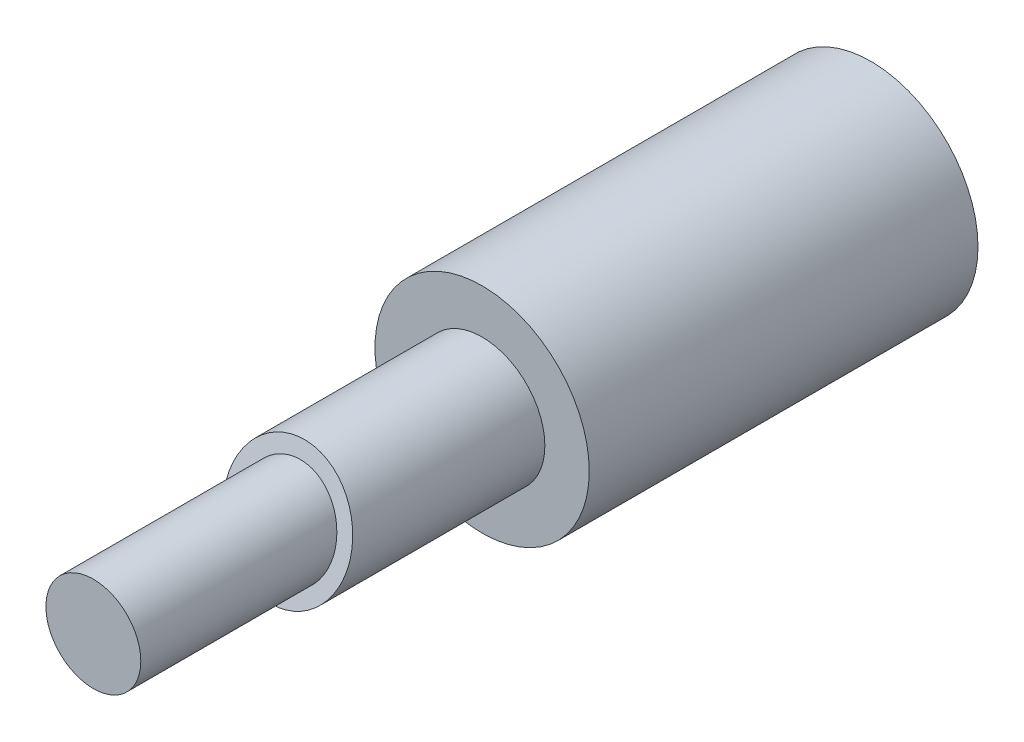
ISO-10303-21;
HEADER;
FILE_DESCRIPTION(('STEP AP214'),'2;1');
FILE_NAME('part.step','',(''),(''),'','','');
FILE_SCHEMA(('AUTOMOTIVE_DESIGN { 1 0 10303 214 1 1 1 1 }'));
ENDSEC;
DATA;
#1=APPLICATION_CONTEXT('core data for automotive mechanical design processes');
#2=APPLICATION_PROTOCOL_DEFINITION('international standard','automotive_design',2000,#1);
#3=PRODUCT_CONTEXT('',#1,'mechanical');
#4=PRODUCT('Part','Part','',(#3));
#5=PRODUCT_RELATED_PRODUCT_CATEGORY('part','',(#4));
#6=PRODUCT_DEFINITION_FORMATION('','',#4);
#7=PRODUCT_DEFINITION_CONTEXT('part definition',#1,'design');
#8=PRODUCT_DEFINITION('design','',#6,#7);
#9=PRODUCT_DEFINITION_SHAPE('','',#8);
#10=(LENGTH_UNIT() NAMED_UNIT(*) SI_UNIT(.MILLI.,.METRE.));
#11=(NAMED_UNIT(*) PLANE_ANGLE_UNIT() SI_UNIT($,.RADIAN.));
#12=(NAMED_UNIT(*) SI_UNIT($,.STERADIAN.) SOLID_ANGLE_UNIT());
#13=UNCERTAINTY_MEASURE_WITH_UNIT(LENGTH_MEASURE(1.E-05),#10,'distance_accuracy_value','');
#14=(GEOMETRIC_REPRESENTATION_CONTEXT(3) GLOBAL_UNCERTAINTY_ASSIGNED_CONTEXT((#13)) GLOBAL_UNIT_ASSIGNED_CONTEXT((#10,
#11,#12)) REPRESENTATION_CONTEXT('',''));
#15=CARTESIAN_POINT('',(0.,0.,0.));
#16=DIRECTION('',(0.,0.,1.));
#17=DIRECTION('',(1.,0.,0.));
#18=AXIS2_PLACEMENT_3D('',#15,#16,#17);
#19=CARTESIAN_POINT('',(0.,0.,-101.6));
#20=DIRECTION('',(0.,0.,-1.));
#21=DIRECTION('',(-1.,0.,0.));
#22=AXIS2_PLACEMENT_3D('',#19,#20,#21);
#23=PLANE('',#22);
#24=CARTESIAN_POINT('',(0.,0.,-101.6));
#25=DIRECTION('',(0.,0.,1.));
#26=DIRECTION('',(1.,0.,0.));
#27=AXIS2_PLACEMENT_3D('',#24,#25,#26);
#28=CIRCLE('',#27,14.);
#29=CARTESIAN_POINT('',(14.,0.,-101.6));
#30=VERTEX_POINT('',#29);
#31=EDGE_CURVE('E10',#30,#30,#28,.T.);
#32=ORIENTED_EDGE('',*,*,#31,.F.);
#33=EDGE_LOOP('',(#32));
#34=FACE_BOUND('',#33,.T.);
#35=ADVANCED_FACE('F39',(#34),#23,.T.);
#36=CARTESIAN_POINT('',(0.,0.,0.));
#37=DIRECTION('',(0.,0.,1.));
#38=DIRECTION('',(1.,0.,0.));
#39=AXIS2_PLACEMENT_3D('',#36,#37,#38);
#40=CYLINDRICAL_SURFACE('',#39,14.);
#41=ORIENTED_EDGE('',*,*,#31,.T.);
#42=EDGE_LOOP('',(#41));
#43=FACE_BOUND('',#42,.T.);
#44=CARTESIAN_POINT('',(0.,0.,-50.8));
#45=DIRECTION('',(0.,0.,1.));
#46=DIRECTION('',(1.,0.,0.));
#47=AXIS2_PLACEMENT_3D('',#44,#45,#46);
#48=CIRCLE('',#47,14.);
#49=CARTESIAN_POINT('',(14.,0.,-50.8));
#50=VERTEX_POINT('',#49);
#51=EDGE_CURVE('E47',#50,#50,#48,.T.);
#52=ORIENTED_EDGE('',*,*,#51,.F.);
#53=EDGE_LOOP('',(#52));
#54=FACE_BOUND('',#53,.T.);
#55=ADVANCED_FACE('F81',(#43,#54),#40,.T.);
#56=CARTESIAN_POINT('',(14.,0.,-50.8));
#57=DIRECTION('',(0.,0.,1.));
#58=DIRECTION('',(1.,0.,0.));
#59=AXIS2_PLACEMENT_3D('',#56,#57,#58);
#60=PLANE('',#59);
#61=ORIENTED_EDGE('',*,*,#51,.T.);
#62=EDGE_LOOP('',(#61));
#63=FACE_BOUND('',#62,.T.);
#64=CARTESIAN_POINT('',(0.,0.,-50.8));
#65=DIRECTION('',(0.,0.,1.));
#66=DIRECTION('',(1.,0.,0.));
#67=AXIS2_PLACEMENT_3D('',#64,#65,#66);
#68=CIRCLE('',#67,8.19999999999999);
#69=CARTESIAN_POINT('',(8.19999999999999,0.,-50.8));
#70=VERTEX_POINT('',#69);
#71=EDGE_CURVE('E52',#70,#70,#68,.T.);
#72=ORIENTED_EDGE('',*,*,#71,.F.);
#73=EDGE_LOOP('',(#72));
#74=FACE_BOUND('',#73,.T.);
#75=ADVANCED_FACE('F86',(#63,#74),#60,.T.);
#76=CARTESIAN_POINT('',(0.,0.,0.));
#77=DIRECTION('',(0.,0.,1.));
#78=DIRECTION('',(1.,0.,0.));
#79=AXIS2_PLACEMENT_3D('',#76,#77,#78);
#80=CYLINDRICAL_SURFACE('',#79,8.19999999999999);
#81=ORIENTED_EDGE('',*,*,#71,.T.);
#82=EDGE_LOOP('',(#81));
#83=FACE_BOUND('',#82,.T.);
#84=CARTESIAN_POINT('',(0.,0.,-25.4));
#85=DIRECTION('',(0.,0.258819045102521,0.965925826289068));
#86=DIRECTION('',(0.,-0.965925826289068,0.258819045102521));
#87=AXIS2_PLACEMENT_3D('',#84,#85,#86);
#88=ELLIPSE('',#87,8.48926467936268,8.19999999999999);
#89=CARTESIAN_POINT('',(0.,-8.19999999999999,-23.2028166220648));
#90=VERTEX_POINT('',#89);
#91=EDGE_CURVE('E55',#90,#90,#88,.T.);
#92=ORIENTED_EDGE('',*,*,#91,.F.);
#93=EDGE_LOOP('',(#92));
#94=FACE_BOUND('',#93,.T.);
#95=ADVANCED_FACE('F78',(#83,#94),#80,.T.);
#96=CARTESIAN_POINT('',(0.,0.,-25.4));
#97=DIRECTION('',(0.,0.258819045102521,0.965925826289068));
#98=DIRECTION('',(0.,-0.965925826289068,0.258819045102521));
#99=AXIS2_PLACEMENT_3D('',#96,#97,#98);
#100=PLANE('',#99);
#101=ORIENTED_EDGE('',*,*,#91,.T.);
#102=EDGE_LOOP('',(#101));
#103=FACE_BOUND('',#102,.T.);
#104=CARTESIAN_POINT('',(0.,0.,-25.4));
#105=DIRECTION('',(0.,0.258819045102521,0.965925826289068));
#106=DIRECTION('',(0.,-0.965925826289068,0.258819045102521));
#107=AXIS2_PLACEMENT_3D('',#104,#105,#106);
#108=ELLIPSE('',#107,6.41871231854251,6.2);
#109=CARTESIAN_POINT('',(0.,-6.2,-23.738715006927));
#110=VERTEX_POINT('',#109);
#111=EDGE_CURVE('E43',#110,#110,#108,.T.);
#112=ORIENTED_EDGE('',*,*,#111,.F.);
#113=EDGE_LOOP('',(#112));
#114=FACE_BOUND('',#113,.T.);
#115=ADVANCED_FACE('F41',(#103,#114),#100,.T.);
#116=CARTESIAN_POINT('',(0.,0.,0.));
#117=DIRECTION('',(0.,0.,1.));
#118=DIRECTION('',(1.,0.,0.));
#119=AXIS2_PLACEMENT_3D('',#116,#117,#118);
#120=CYLINDRICAL_SURFACE('',#119,6.2);
#121=ORIENTED_EDGE('',*,*,#111,.T.);
#122=EDGE_LOOP('',(#121));
#123=FACE_BOUND('',#122,.T.);
#124=CARTESIAN_POINT('',(0.,0.,0.));
#125=DIRECTION('',(0.,0.,1.));
#126=DIRECTION('',(1.,0.,0.));
#127=AXIS2_PLACEMENT_3D('',#124,#125,#126);
#128=CIRCLE('',#127,6.2);
#129=CARTESIAN_POINT('',(6.2,0.,0.));
#130=VERTEX_POINT('',#129);
#131=EDGE_CURVE('E61',#130,#130,#128,.T.);
#132=ORIENTED_EDGE('',*,*,#131,.F.);
#133=EDGE_LOOP('',(#132));
#134=FACE_BOUND('',#133,.T.);
#135=ADVANCED_FACE('F70',(#123,#134),#120,.T.);
#136=CARTESIAN_POINT('',(6.2,0.,0.));
#137=DIRECTION('',(0.,0.,1.));
#138=DIRECTION('',(1.,0.,0.));
#139=AXIS2_PLACEMENT_3D('',#136,#137,#138);
#140=PLANE('',#139);
#141=ORIENTED_EDGE('',*,*,#131,.T.);
#142=EDGE_LOOP('',(#141));
#143=FACE_BOUND('',#142,.T.);
#144=ADVANCED_FACE('F68',(#143),#140,.T.);
#145=CLOSED_SHELL('',(#35,#55,#75,#95,#115,#135,#144));
#146=MANIFOLD_SOLID_BREP('B2',#145);
#147=ADVANCED_BREP_SHAPE_REPRESENTATION('',(#18,#146),#14);
#148=SHAPE_DEFINITION_REPRESENTATION(#9,#147);
ENDSEC;
END-ISO-10303-21;
